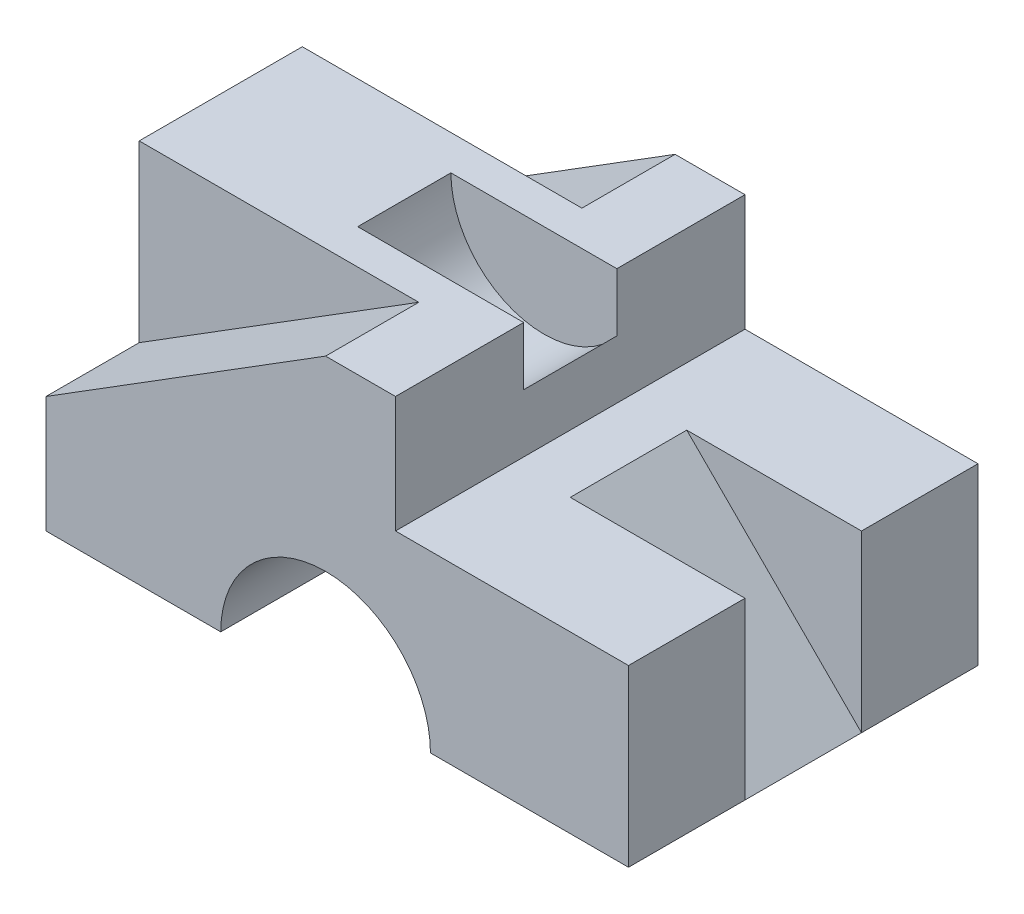
ISO-10303-21;
HEADER;
FILE_DESCRIPTION(('STEP AP214'),'2;1');
FILE_NAME('part.step','',(''),(''),'','','');
FILE_SCHEMA(('AUTOMOTIVE_DESIGN { 1 0 10303 214 1 1 1 1 }'));
ENDSEC;
DATA;
#1=APPLICATION_CONTEXT('core data for automotive mechanical design processes');
#2=APPLICATION_PROTOCOL_DEFINITION('international standard','automotive_design',2000,#1);
#3=PRODUCT_CONTEXT('',#1,'mechanical');
#4=PRODUCT('Part','Part','',(#3));
#5=PRODUCT_RELATED_PRODUCT_CATEGORY('part','',(#4));
#6=PRODUCT_DEFINITION_FORMATION('','',#4);
#7=PRODUCT_DEFINITION_CONTEXT('part definition',#1,'design');
#8=PRODUCT_DEFINITION('design','',#6,#7);
#9=PRODUCT_DEFINITION_SHAPE('','',#8);
#10=(LENGTH_UNIT() NAMED_UNIT(*) SI_UNIT(.MILLI.,.METRE.));
#11=(NAMED_UNIT(*) PLANE_ANGLE_UNIT() SI_UNIT($,.RADIAN.));
#12=(NAMED_UNIT(*) SI_UNIT($,.STERADIAN.) SOLID_ANGLE_UNIT());
#13=UNCERTAINTY_MEASURE_WITH_UNIT(LENGTH_MEASURE(1.E-05),#10,'distance_accuracy_value','');
#14=(GEOMETRIC_REPRESENTATION_CONTEXT(3) GLOBAL_UNCERTAINTY_ASSIGNED_CONTEXT((#13)) GLOBAL_UNIT_ASSIGNED_CONTEXT((#10,
#11,#12)) REPRESENTATION_CONTEXT('',''));
#15=CARTESIAN_POINT('',(0.,0.,0.));
#16=DIRECTION('',(0.,0.,1.));
#17=DIRECTION('',(1.,0.,0.));
#18=AXIS2_PLACEMENT_3D('',#15,#16,#17);
#19=CARTESIAN_POINT('',(60.,30.,-30.));
#20=DIRECTION('',(0.,1.,0.));
#21=DIRECTION('',(0.,0.,1.));
#22=AXIS2_PLACEMENT_3D('',#19,#20,#21);
#23=PLANE('',#22);
#24=DIRECTION('',(0.,0.,1.));
#25=VECTOR('',#24,1.);
#26=CARTESIAN_POINT('',(70.,30.,-10.));
#27=LINE('',#26,#25);
#28=CARTESIAN_POINT('',(70.,30.,-10.));
#29=VERTEX_POINT('',#28);
#30=CARTESIAN_POINT('',(70.,30.,10.));
#31=VERTEX_POINT('',#30);
#32=EDGE_CURVE('E169',#29,#31,#27,.T.);
#33=ORIENTED_EDGE('',*,*,#32,.F.);
#34=DIRECTION('',(-1.,0.,0.));
#35=VECTOR('',#34,1.);
#36=CARTESIAN_POINT('',(100.,30.,-10.));
#37=LINE('',#36,#35);
#38=CARTESIAN_POINT('',(100.,30.,-10.));
#39=VERTEX_POINT('',#38);
#40=EDGE_CURVE('E170',#39,#29,#37,.T.);
#41=ORIENTED_EDGE('',*,*,#40,.F.);
#42=DIRECTION('',(0.,0.,1.));
#43=VECTOR('',#42,1.);
#44=CARTESIAN_POINT('',(100.,30.,-30.));
#45=LINE('',#44,#43);
#46=CARTESIAN_POINT('',(100.,30.,-30.));
#47=VERTEX_POINT('',#46);
#48=EDGE_CURVE('E186',#47,#39,#45,.T.);
#49=ORIENTED_EDGE('',*,*,#48,.F.);
#50=DIRECTION('',(-1.,0.,0.));
#51=VECTOR('',#50,1.);
#52=CARTESIAN_POINT('',(60.,30.,-30.));
#53=LINE('',#52,#51);
#54=CARTESIAN_POINT('',(60.,30.,-30.));
#55=VERTEX_POINT('',#54);
#56=EDGE_CURVE('E331',#47,#55,#53,.T.);
#57=ORIENTED_EDGE('',*,*,#56,.T.);
#58=DIRECTION('',(0.,0.,1.));
#59=VECTOR('',#58,1.);
#60=CARTESIAN_POINT('',(60.,30.,-30.));
#61=LINE('',#60,#59);
#62=CARTESIAN_POINT('',(60.,30.,30.));
#63=VERTEX_POINT('',#62);
#64=EDGE_CURVE('E246',#55,#63,#61,.T.);
#65=ORIENTED_EDGE('',*,*,#64,.T.);
#66=DIRECTION('',(-1.,0.,0.));
#67=VECTOR('',#66,1.);
#68=CARTESIAN_POINT('',(60.,30.,30.));
#69=LINE('',#68,#67);
#70=CARTESIAN_POINT('',(100.,30.,30.));
#71=VERTEX_POINT('',#70);
#72=EDGE_CURVE('E230',#71,#63,#69,.T.);
#73=ORIENTED_EDGE('',*,*,#72,.F.);
#74=CARTESIAN_POINT('',(100.,30.,10.));
#75=VERTEX_POINT('',#74);
#76=EDGE_CURVE('E193',#75,#71,#45,.T.);
#77=ORIENTED_EDGE('',*,*,#76,.F.);
#78=DIRECTION('',(-1.,0.,0.));
#79=VECTOR('',#78,1.);
#80=CARTESIAN_POINT('',(100.,30.,10.));
#81=LINE('',#80,#79);
#82=EDGE_CURVE('E178',#75,#31,#81,.T.);
#83=ORIENTED_EDGE('',*,*,#82,.T.);
#84=EDGE_LOOP('',(#33,#41,#49,#57,#65,#73,#77,#83));
#85=FACE_BOUND('',#84,.T.);
#86=ADVANCED_FACE('F36',(#85),#23,.T.);
#87=CARTESIAN_POINT('',(100.,30.,-30.));
#88=DIRECTION('',(1.,0.,0.));
#89=DIRECTION('',(0.,0.,-1.));
#90=AXIS2_PLACEMENT_3D('',#87,#88,#89);
#91=PLANE('',#90);
#92=ORIENTED_EDGE('',*,*,#48,.T.);
#93=DIRECTION('',(0.,1.,0.));
#94=VECTOR('',#93,1.);
#95=CARTESIAN_POINT('',(100.,0.,-10.));
#96=LINE('',#95,#94);
#97=CARTESIAN_POINT('',(100.,0.,-10.));
#98=VERTEX_POINT('',#97);
#99=EDGE_CURVE('E175',#98,#39,#96,.T.);
#100=ORIENTED_EDGE('',*,*,#99,.F.);
#101=DIRECTION('',(0.,0.,1.));
#102=VECTOR('',#101,1.);
#103=CARTESIAN_POINT('',(100.,0.,-30.));
#104=LINE('',#103,#102);
#105=CARTESIAN_POINT('',(100.,0.,-30.));
#106=VERTEX_POINT('',#105);
#107=EDGE_CURVE('E184',#106,#98,#104,.T.);
#108=ORIENTED_EDGE('',*,*,#107,.F.);
#109=DIRECTION('',(0.,1.,0.));
#110=VECTOR('',#109,1.);
#111=CARTESIAN_POINT('',(100.,30.,-30.));
#112=LINE('',#111,#110);
#113=EDGE_CURVE('E329',#106,#47,#112,.T.);
#114=ORIENTED_EDGE('',*,*,#113,.T.);
#115=EDGE_LOOP('',(#92,#100,#108,#114));
#116=FACE_BOUND('',#115,.T.);
#117=ADVANCED_FACE('F182',(#116),#91,.T.);
#118=CARTESIAN_POINT('',(0.,50.,-30.));
#119=DIRECTION('',(0.,1.,0.));
#120=DIRECTION('',(0.,0.,1.));
#121=AXIS2_PLACEMENT_3D('',#118,#119,#120);
#122=PLANE('',#121);
#123=DIRECTION('',(0.,0.,1.));
#124=VECTOR('',#123,1.);
#125=CARTESIAN_POINT('',(31.5100040032032,50.,-8.));
#126=LINE('',#125,#124);
#127=CARTESIAN_POINT('',(31.5100040032032,50.,-8.));
#128=VERTEX_POINT('',#127);
#129=CARTESIAN_POINT('',(31.5100040032032,50.,8.));
#130=VERTEX_POINT('',#129);
#131=EDGE_CURVE('E288',#128,#130,#126,.T.);
#132=ORIENTED_EDGE('',*,*,#131,.F.);
#133=DIRECTION('',(-1.,0.,0.));
#134=VECTOR('',#133,1.);
#135=CARTESIAN_POINT('',(60.,50.,-8.));
#136=LINE('',#135,#134);
#137=CARTESIAN_POINT('',(60.,50.,-8.));
#138=VERTEX_POINT('',#137);
#139=EDGE_CURVE('E282',#138,#128,#136,.T.);
#140=ORIENTED_EDGE('',*,*,#139,.F.);
#141=DIRECTION('',(0.,0.,1.));
#142=VECTOR('',#141,1.);
#143=CARTESIAN_POINT('',(60.,50.,-30.));
#144=LINE('',#143,#142);
#145=CARTESIAN_POINT('',(60.,50.,-30.));
#146=VERTEX_POINT('',#145);
#147=EDGE_CURVE('E243',#146,#138,#144,.T.);
#148=ORIENTED_EDGE('',*,*,#147,.F.);
#149=DIRECTION('',(-1.,0.,0.));
#150=VECTOR('',#149,1.);
#151=CARTESIAN_POINT('',(48.,50.,-30.));
#152=LINE('',#151,#150);
#153=CARTESIAN_POINT('',(48.,50.,-30.));
#154=VERTEX_POINT('',#153);
#155=EDGE_CURVE('E206',#146,#154,#152,.T.);
#156=ORIENTED_EDGE('',*,*,#155,.T.);
#157=DIRECTION('',(0.,0.,-1.));
#158=VECTOR('',#157,1.);
#159=CARTESIAN_POINT('',(48.,50.,-14.));
#160=LINE('',#159,#158);
#161=CARTESIAN_POINT('',(48.,50.,-14.));
#162=VERTEX_POINT('',#161);
#163=EDGE_CURVE('E305',#162,#154,#160,.T.);
#164=ORIENTED_EDGE('',*,*,#163,.F.);
#165=DIRECTION('',(-1.,0.,0.));
#166=VECTOR('',#165,1.);
#167=CARTESIAN_POINT('',(48.,50.,-14.));
#168=LINE('',#167,#166);
#169=CARTESIAN_POINT('',(0.,50.,-14.));
#170=VERTEX_POINT('',#169);
#171=EDGE_CURVE('E300',#162,#170,#168,.T.);
#172=ORIENTED_EDGE('',*,*,#171,.T.);
#173=DIRECTION('',(0.,0.,1.));
#174=VECTOR('',#173,1.);
#175=CARTESIAN_POINT('',(0.,50.,-30.));
#176=LINE('',#175,#174);
#177=CARTESIAN_POINT('',(0.,50.,14.));
#178=VERTEX_POINT('',#177);
#179=EDGE_CURVE('E45',#170,#178,#176,.T.);
#180=ORIENTED_EDGE('',*,*,#179,.T.);
#181=DIRECTION('',(-1.,0.,0.));
#182=VECTOR('',#181,1.);
#183=CARTESIAN_POINT('',(48.,50.,14.));
#184=LINE('',#183,#182);
#185=CARTESIAN_POINT('',(48.,50.,14.));
#186=VERTEX_POINT('',#185);
#187=EDGE_CURVE('E318',#186,#178,#184,.T.);
#188=ORIENTED_EDGE('',*,*,#187,.F.);
#189=DIRECTION('',(0.,0.,1.));
#190=VECTOR('',#189,1.);
#191=CARTESIAN_POINT('',(48.,50.,14.));
#192=LINE('',#191,#190);
#193=CARTESIAN_POINT('',(48.,50.,30.));
#194=VERTEX_POINT('',#193);
#195=EDGE_CURVE('E221',#186,#194,#192,.T.);
#196=ORIENTED_EDGE('',*,*,#195,.T.);
#197=DIRECTION('',(-1.,0.,0.));
#198=VECTOR('',#197,1.);
#199=CARTESIAN_POINT('',(0.,50.,30.));
#200=LINE('',#199,#198);
#201=CARTESIAN_POINT('',(60.,50.,30.));
#202=VERTEX_POINT('',#201);
#203=EDGE_CURVE('E236',#202,#194,#200,.T.);
#204=ORIENTED_EDGE('',*,*,#203,.F.);
#205=CARTESIAN_POINT('',(60.,50.,8.));
#206=VERTEX_POINT('',#205);
#207=EDGE_CURVE('E245',#206,#202,#144,.T.);
#208=ORIENTED_EDGE('',*,*,#207,.F.);
#209=DIRECTION('',(-1.,0.,0.));
#210=VECTOR('',#209,1.);
#211=CARTESIAN_POINT('',(60.,50.,8.));
#212=LINE('',#211,#210);
#213=EDGE_CURVE('E61',#206,#130,#212,.T.);
#214=ORIENTED_EDGE('',*,*,#213,.T.);
#215=EDGE_LOOP('',(#132,#140,#148,#156,#164,#172,#180,#188,#196,#204,#208,#214));
#216=FACE_BOUND('',#215,.T.);
#217=ADVANCED_FACE('F260',(#216),#122,.T.);
#218=CARTESIAN_POINT('',(60.,50.,-30.));
#219=DIRECTION('',(1.,0.,0.));
#220=DIRECTION('',(0.,1.,0.));
#221=AXIS2_PLACEMENT_3D('',#218,#219,#220);
#222=PLANE('',#221);
#223=ORIENTED_EDGE('',*,*,#147,.T.);
#224=DIRECTION('',(0.,1.,0.));
#225=VECTOR('',#224,1.);
#226=CARTESIAN_POINT('',(60.,40.,-8.));
#227=LINE('',#226,#225);
#228=CARTESIAN_POINT('',(60.,40.,-8.));
#229=VERTEX_POINT('',#228);
#230=EDGE_CURVE('E280',#229,#138,#227,.T.);
#231=ORIENTED_EDGE('',*,*,#230,.F.);
#232=DIRECTION('',(0.,0.,1.));
#233=VECTOR('',#232,1.);
#234=CARTESIAN_POINT('',(60.,40.,-8.));
#235=LINE('',#234,#233);
#236=CARTESIAN_POINT('',(60.,40.,8.));
#237=VERTEX_POINT('',#236);
#238=EDGE_CURVE('E293',#229,#237,#235,.T.);
#239=ORIENTED_EDGE('',*,*,#238,.T.);
#240=DIRECTION('',(0.,1.,0.));
#241=VECTOR('',#240,1.);
#242=CARTESIAN_POINT('',(60.,40.,8.));
#243=LINE('',#242,#241);
#244=EDGE_CURVE('E256',#237,#206,#243,.T.);
#245=ORIENTED_EDGE('',*,*,#244,.T.);
#246=ORIENTED_EDGE('',*,*,#207,.T.);
#247=DIRECTION('',(0.,1.,0.));
#248=VECTOR('',#247,1.);
#249=CARTESIAN_POINT('',(60.,50.,30.));
#250=LINE('',#249,#248);
#251=EDGE_CURVE('E233',#63,#202,#250,.T.);
#252=ORIENTED_EDGE('',*,*,#251,.F.);
#253=ORIENTED_EDGE('',*,*,#64,.F.);
#254=DIRECTION('',(0.,1.,0.));
#255=VECTOR('',#254,1.);
#256=CARTESIAN_POINT('',(60.,50.,-30.));
#257=LINE('',#256,#255);
#258=EDGE_CURVE('E213',#55,#146,#257,.T.);
#259=ORIENTED_EDGE('',*,*,#258,.T.);
#260=EDGE_LOOP('',(#223,#231,#239,#245,#246,#252,#253,#259));
#261=FACE_BOUND('',#260,.T.);
#262=ADVANCED_FACE('F254',(#261),#222,.T.);
#263=CARTESIAN_POINT('',(0.,0.,-30.));
#264=DIRECTION('',(-1.,0.,0.));
#265=DIRECTION('',(0.,0.,1.));
#266=AXIS2_PLACEMENT_3D('',#263,#264,#265);
#267=PLANE('',#266);
#268=DIRECTION('',(0.,-1.,0.));
#269=VECTOR('',#268,1.);
#270=CARTESIAN_POINT('',(0.,50.,-14.));
#271=LINE('',#270,#269);
#272=CARTESIAN_POINT('',(0.,20.,-14.));
#273=VERTEX_POINT('',#272);
#274=EDGE_CURVE('E297',#170,#273,#271,.T.);
#275=ORIENTED_EDGE('',*,*,#274,.T.);
#276=DIRECTION('',(0.,0.,-1.));
#277=VECTOR('',#276,1.);
#278=CARTESIAN_POINT('',(0.,20.,-14.));
#279=LINE('',#278,#277);
#280=CARTESIAN_POINT('',(0.,20.,-30.));
#281=VERTEX_POINT('',#280);
#282=EDGE_CURVE('E308',#273,#281,#279,.T.);
#283=ORIENTED_EDGE('',*,*,#282,.T.);
#284=DIRECTION('',(0.,-1.,0.));
#285=VECTOR('',#284,1.);
#286=CARTESIAN_POINT('',(0.,20.,-30.));
#287=LINE('',#286,#285);
#288=CARTESIAN_POINT('',(0.,0.,-30.));
#289=VERTEX_POINT('',#288);
#290=EDGE_CURVE('E202',#281,#289,#287,.T.);
#291=ORIENTED_EDGE('',*,*,#290,.T.);
#292=DIRECTION('',(0.,0.,1.));
#293=VECTOR('',#292,1.);
#294=CARTESIAN_POINT('',(0.,0.,-30.));
#295=LINE('',#294,#293);
#296=CARTESIAN_POINT('',(0.,0.,30.));
#297=VERTEX_POINT('',#296);
#298=EDGE_CURVE('E11',#289,#297,#295,.T.);
#299=ORIENTED_EDGE('',*,*,#298,.T.);
#300=DIRECTION('',(0.,-1.,0.));
#301=VECTOR('',#300,1.);
#302=CARTESIAN_POINT('',(0.,0.,30.));
#303=LINE('',#302,#301);
#304=CARTESIAN_POINT('',(0.,20.,30.));
#305=VERTEX_POINT('',#304);
#306=EDGE_CURVE('E239',#305,#297,#303,.T.);
#307=ORIENTED_EDGE('',*,*,#306,.F.);
#308=DIRECTION('',(0.,0.,1.));
#309=VECTOR('',#308,1.);
#310=CARTESIAN_POINT('',(0.,20.,14.));
#311=LINE('',#310,#309);
#312=CARTESIAN_POINT('',(0.,20.,14.));
#313=VERTEX_POINT('',#312);
#314=EDGE_CURVE('E321',#313,#305,#311,.T.);
#315=ORIENTED_EDGE('',*,*,#314,.F.);
#316=DIRECTION('',(0.,-1.,0.));
#317=VECTOR('',#316,1.);
#318=CARTESIAN_POINT('',(0.,50.,14.));
#319=LINE('',#318,#317);
#320=EDGE_CURVE('E312',#178,#313,#319,.T.);
#321=ORIENTED_EDGE('',*,*,#320,.F.);
#322=ORIENTED_EDGE('',*,*,#179,.F.);
#323=EDGE_LOOP('',(#275,#283,#291,#299,#307,#315,#321,#322));
#324=FACE_BOUND('',#323,.T.);
#325=ADVANCED_FACE('F403',(#324),#267,.T.);
#326=CARTESIAN_POINT('',(48.,0.,-30.));
#327=DIRECTION('',(0.,0.,-1.));
#328=DIRECTION('',(-1.,0.,0.));
#329=AXIS2_PLACEMENT_3D('',#326,#327,#328);
#330=PLANE('',#329);
#331=ORIENTED_EDGE('',*,*,#290,.F.);
#332=DIRECTION('',(0.847998304005088,0.52999894000318,0.));
#333=VECTOR('',#332,1.);
#334=CARTESIAN_POINT('',(0.,20.,-30.));
#335=LINE('',#334,#333);
#336=EDGE_CURVE('E295',#281,#154,#335,.T.);
#337=ORIENTED_EDGE('',*,*,#336,.T.);
#338=ORIENTED_EDGE('',*,*,#155,.F.);
#339=ORIENTED_EDGE('',*,*,#258,.F.);
#340=ORIENTED_EDGE('',*,*,#56,.F.);
#341=ORIENTED_EDGE('',*,*,#113,.F.);
#342=DIRECTION('',(1.,0.,0.));
#343=VECTOR('',#342,1.);
#344=CARTESIAN_POINT('',(66.,0.,-30.));
#345=LINE('',#344,#343);
#346=CARTESIAN_POINT('',(66.,0.,-30.));
#347=VERTEX_POINT('',#346);
#348=EDGE_CURVE('E192',#347,#106,#345,.T.);
#349=ORIENTED_EDGE('',*,*,#348,.F.);
#350=CARTESIAN_POINT('',(48.,0.,-30.));
#351=DIRECTION('',(0.,0.,-1.));
#352=DIRECTION('',(-1.,0.,0.));
#353=AXIS2_PLACEMENT_3D('',#350,#351,#352);
#354=CIRCLE('',#353,18.);
#355=CARTESIAN_POINT('',(30.,0.,-30.));
#356=VERTEX_POINT('',#355);
#357=EDGE_CURVE('E326',#356,#347,#354,.T.);
#358=ORIENTED_EDGE('',*,*,#357,.F.);
#359=DIRECTION('',(1.,0.,0.));
#360=VECTOR('',#359,1.);
#361=CARTESIAN_POINT('',(0.,0.,-30.));
#362=LINE('',#361,#360);
#363=EDGE_CURVE('E240',#289,#356,#362,.T.);
#364=ORIENTED_EDGE('',*,*,#363,.F.);
#365=EDGE_LOOP('',(#331,#337,#338,#339,#340,#341,#349,#358,#364));
#366=FACE_BOUND('',#365,.T.);
#367=ADVANCED_FACE('F338',(#366),#330,.T.);
#368=CARTESIAN_POINT('',(0.,0.,-30.));
#369=DIRECTION('',(0.,-1.,0.));
#370=DIRECTION('',(0.,0.,-1.));
#371=AXIS2_PLACEMENT_3D('',#368,#369,#370);
#372=PLANE('',#371);
#373=DIRECTION('',(1.,0.,0.));
#374=VECTOR('',#373,1.);
#375=CARTESIAN_POINT('',(0.,0.,30.));
#376=LINE('',#375,#374);
#377=CARTESIAN_POINT('',(30.,0.,30.));
#378=VERTEX_POINT('',#377);
#379=EDGE_CURVE('E217',#297,#378,#376,.T.);
#380=ORIENTED_EDGE('',*,*,#379,.F.);
#381=ORIENTED_EDGE('',*,*,#298,.F.);
#382=ORIENTED_EDGE('',*,*,#363,.T.);
#383=DIRECTION('',(0.,0.,1.));
#384=VECTOR('',#383,1.);
#385=CARTESIAN_POINT('',(30.,0.,-30.));
#386=LINE('',#385,#384);
#387=EDGE_CURVE('E40',#356,#378,#386,.T.);
#388=ORIENTED_EDGE('',*,*,#387,.T.);
#389=EDGE_LOOP('',(#380,#381,#382,#388));
#390=FACE_BOUND('',#389,.T.);
#391=ADVANCED_FACE('F38',(#390),#372,.T.);
#392=DIRECTION('',(0.,1.,0.));
#393=VECTOR('',#392,1.);
#394=CARTESIAN_POINT('',(100.,0.,10.));
#395=LINE('',#394,#393);
#396=CARTESIAN_POINT('',(100.,0.,10.));
#397=VERTEX_POINT('',#396);
#398=EDGE_CURVE('E272',#397,#75,#395,.T.);
#399=ORIENTED_EDGE('',*,*,#398,.T.);
#400=ORIENTED_EDGE('',*,*,#76,.T.);
#401=DIRECTION('',(0.,1.,0.));
#402=VECTOR('',#401,1.);
#403=CARTESIAN_POINT('',(100.,30.,30.));
#404=LINE('',#403,#402);
#405=CARTESIAN_POINT('',(100.,0.,30.));
#406=VERTEX_POINT('',#405);
#407=EDGE_CURVE('E227',#406,#71,#404,.T.);
#408=ORIENTED_EDGE('',*,*,#407,.F.);
#409=EDGE_CURVE('E194',#397,#406,#104,.T.);
#410=ORIENTED_EDGE('',*,*,#409,.F.);
#411=EDGE_LOOP('',(#399,#400,#408,#410));
#412=FACE_BOUND('',#411,.T.);
#413=ADVANCED_FACE('F270',(#412),#91,.T.);
#414=CARTESIAN_POINT('',(66.,0.,-30.));
#415=DIRECTION('',(0.,-1.,0.));
#416=DIRECTION('',(0.,0.,-1.));
#417=AXIS2_PLACEMENT_3D('',#414,#415,#416);
#418=PLANE('',#417);
#419=DIRECTION('',(1.,0.,0.));
#420=VECTOR('',#419,1.);
#421=CARTESIAN_POINT('',(66.,0.,30.));
#422=LINE('',#421,#420);
#423=CARTESIAN_POINT('',(66.,0.,30.));
#424=VERTEX_POINT('',#423);
#425=EDGE_CURVE('E224',#424,#406,#422,.T.);
#426=ORIENTED_EDGE('',*,*,#425,.F.);
#427=DIRECTION('',(0.,0.,1.));
#428=VECTOR('',#427,1.);
#429=CARTESIAN_POINT('',(66.,0.,-30.));
#430=LINE('',#429,#428);
#431=EDGE_CURVE('E197',#347,#424,#430,.T.);
#432=ORIENTED_EDGE('',*,*,#431,.F.);
#433=ORIENTED_EDGE('',*,*,#348,.T.);
#434=ORIENTED_EDGE('',*,*,#107,.T.);
#435=DIRECTION('',(0.,0.,1.));
#436=VECTOR('',#435,1.);
#437=CARTESIAN_POINT('',(100.,0.,-10.));
#438=LINE('',#437,#436);
#439=EDGE_CURVE('E162',#98,#397,#438,.T.);
#440=ORIENTED_EDGE('',*,*,#439,.T.);
#441=ORIENTED_EDGE('',*,*,#409,.T.);
#442=EDGE_LOOP('',(#426,#432,#433,#434,#440,#441));
#443=FACE_BOUND('',#442,.T.);
#444=ADVANCED_FACE('F190',(#443),#418,.T.);
#445=CARTESIAN_POINT('',(48.,0.,-30.));
#446=DIRECTION('',(0.,0.,1.));
#447=DIRECTION('',(1.,0.,0.));
#448=AXIS2_PLACEMENT_3D('',#445,#446,#447);
#449=CYLINDRICAL_SURFACE('',#448,18.);
#450=CARTESIAN_POINT('',(48.,0.,30.));
#451=DIRECTION('',(0.,0.,-1.));
#452=DIRECTION('',(-1.,0.,0.));
#453=AXIS2_PLACEMENT_3D('',#450,#451,#452);
#454=CIRCLE('',#453,18.);
#455=EDGE_CURVE('E220',#378,#424,#454,.T.);
#456=ORIENTED_EDGE('',*,*,#455,.F.);
#457=ORIENTED_EDGE('',*,*,#387,.F.);
#458=ORIENTED_EDGE('',*,*,#357,.T.);
#459=ORIENTED_EDGE('',*,*,#431,.T.);
#460=EDGE_LOOP('',(#456,#457,#458,#459));
#461=FACE_BOUND('',#460,.T.);
#462=ADVANCED_FACE('F358',(#461),#449,.F.);
#463=CARTESIAN_POINT('',(48.,0.,30.));
#464=DIRECTION('',(0.,0.,-1.));
#465=DIRECTION('',(-1.,0.,0.));
#466=AXIS2_PLACEMENT_3D('',#463,#464,#465);
#467=PLANE('',#466);
#468=ORIENTED_EDGE('',*,*,#203,.T.);
#469=DIRECTION('',(0.847998304005088,0.52999894000318,0.));
#470=VECTOR('',#469,1.);
#471=CARTESIAN_POINT('',(0.,20.,30.));
#472=LINE('',#471,#470);
#473=EDGE_CURVE('E310',#305,#194,#472,.T.);
#474=ORIENTED_EDGE('',*,*,#473,.F.);
#475=ORIENTED_EDGE('',*,*,#306,.T.);
#476=ORIENTED_EDGE('',*,*,#379,.T.);
#477=ORIENTED_EDGE('',*,*,#455,.T.);
#478=ORIENTED_EDGE('',*,*,#425,.T.);
#479=ORIENTED_EDGE('',*,*,#407,.T.);
#480=ORIENTED_EDGE('',*,*,#72,.T.);
#481=ORIENTED_EDGE('',*,*,#251,.T.);
#482=EDGE_LOOP('',(#468,#474,#475,#476,#477,#478,#479,#480,#481));
#483=FACE_BOUND('',#482,.T.);
#484=ADVANCED_FACE('F264',(#483),#467,.F.);
#485=CARTESIAN_POINT('',(0.,20.,14.));
#486=DIRECTION('',(0.52999894000318,-0.847998304005088,0.));
#487=DIRECTION('',(0.847998304005088,0.52999894000318,0.));
#488=AXIS2_PLACEMENT_3D('',#485,#486,#487);
#489=PLANE('',#488);
#490=ORIENTED_EDGE('',*,*,#473,.T.);
#491=ORIENTED_EDGE('',*,*,#195,.F.);
#492=DIRECTION('',(0.847998304005088,0.52999894000318,0.));
#493=VECTOR('',#492,1.);
#494=CARTESIAN_POINT('',(0.,20.,14.));
#495=LINE('',#494,#493);
#496=EDGE_CURVE('E315',#313,#186,#495,.T.);
#497=ORIENTED_EDGE('',*,*,#496,.F.);
#498=ORIENTED_EDGE('',*,*,#314,.T.);
#499=EDGE_LOOP('',(#490,#491,#497,#498));
#500=FACE_BOUND('',#499,.T.);
#501=ADVANCED_FACE('F363',(#500),#489,.F.);
#502=CARTESIAN_POINT('',(0.,0.,14.));
#503=DIRECTION('',(0.,0.,-1.));
#504=DIRECTION('',(-1.,0.,0.));
#505=AXIS2_PLACEMENT_3D('',#502,#503,#504);
#506=PLANE('',#505);
#507=ORIENTED_EDGE('',*,*,#320,.T.);
#508=ORIENTED_EDGE('',*,*,#496,.T.);
#509=ORIENTED_EDGE('',*,*,#187,.T.);
#510=EDGE_LOOP('',(#507,#508,#509));
#511=FACE_BOUND('',#510,.T.);
#512=ADVANCED_FACE('F395',(#511),#506,.F.);
#513=CARTESIAN_POINT('',(0.,20.,-14.));
#514=DIRECTION('',(-0.52999894000318,0.847998304005088,0.));
#515=DIRECTION('',(-0.847998304005088,-0.52999894000318,0.));
#516=AXIS2_PLACEMENT_3D('',#513,#514,#515);
#517=PLANE('',#516);
#518=ORIENTED_EDGE('',*,*,#336,.F.);
#519=ORIENTED_EDGE('',*,*,#282,.F.);
#520=DIRECTION('',(0.847998304005088,0.52999894000318,0.));
#521=VECTOR('',#520,1.);
#522=CARTESIAN_POINT('',(0.,20.,-14.));
#523=LINE('',#522,#521);
#524=EDGE_CURVE('E303',#273,#162,#523,.T.);
#525=ORIENTED_EDGE('',*,*,#524,.T.);
#526=ORIENTED_EDGE('',*,*,#163,.T.);
#527=EDGE_LOOP('',(#518,#519,#525,#526));
#528=FACE_BOUND('',#527,.T.);
#529=ADVANCED_FACE('F391',(#528),#517,.T.);
#530=CARTESIAN_POINT('',(0.,0.,-14.));
#531=DIRECTION('',(0.,0.,1.));
#532=DIRECTION('',(-1.,0.,0.));
#533=AXIS2_PLACEMENT_3D('',#530,#531,#532);
#534=PLANE('',#533);
#535=ORIENTED_EDGE('',*,*,#274,.F.);
#536=ORIENTED_EDGE('',*,*,#171,.F.);
#537=ORIENTED_EDGE('',*,*,#524,.F.);
#538=EDGE_LOOP('',(#535,#536,#537));
#539=FACE_BOUND('',#538,.T.);
#540=ADVANCED_FACE('F388',(#539),#534,.F.);
#541=CARTESIAN_POINT('',(47.5100040032032,50.,-8.));
#542=DIRECTION('',(0.,0.,1.));
#543=DIRECTION('',(1.,0.,0.));
#544=AXIS2_PLACEMENT_3D('',#541,#542,#543);
#545=CYLINDRICAL_SURFACE('',#544,16.);
#546=CARTESIAN_POINT('',(47.5100040032032,50.,8.));
#547=DIRECTION('',(0.,0.,1.));
#548=DIRECTION('',(1.,0.,0.));
#549=AXIS2_PLACEMENT_3D('',#546,#547,#548);
#550=CIRCLE('',#549,16.);
#551=EDGE_CURVE('E283',#130,#237,#550,.T.);
#552=ORIENTED_EDGE('',*,*,#551,.T.);
#553=ORIENTED_EDGE('',*,*,#238,.F.);
#554=CARTESIAN_POINT('',(47.5100040032032,50.,-8.));
#555=DIRECTION('',(0.,0.,1.));
#556=DIRECTION('',(1.,0.,0.));
#557=AXIS2_PLACEMENT_3D('',#554,#555,#556);
#558=CIRCLE('',#557,16.);
#559=EDGE_CURVE('E285',#128,#229,#558,.T.);
#560=ORIENTED_EDGE('',*,*,#559,.F.);
#561=ORIENTED_EDGE('',*,*,#131,.T.);
#562=EDGE_LOOP('',(#552,#553,#560,#561));
#563=FACE_BOUND('',#562,.T.);
#564=ADVANCED_FACE('F376',(#563),#545,.F.);
#565=CARTESIAN_POINT('',(47.5100040032032,50.,-8.));
#566=DIRECTION('',(0.,0.,1.));
#567=DIRECTION('',(1.,0.,0.));
#568=AXIS2_PLACEMENT_3D('',#565,#566,#567);
#569=PLANE('',#568);
#570=ORIENTED_EDGE('',*,*,#230,.T.);
#571=ORIENTED_EDGE('',*,*,#139,.T.);
#572=ORIENTED_EDGE('',*,*,#559,.T.);
#573=EDGE_LOOP('',(#570,#571,#572));
#574=FACE_BOUND('',#573,.T.);
#575=ADVANCED_FACE('F374',(#574),#569,.T.);
#576=CARTESIAN_POINT('',(47.5100040032032,50.,8.));
#577=DIRECTION('',(0.,0.,1.));
#578=DIRECTION('',(1.,0.,0.));
#579=AXIS2_PLACEMENT_3D('',#576,#577,#578);
#580=PLANE('',#579);
#581=ORIENTED_EDGE('',*,*,#244,.F.);
#582=ORIENTED_EDGE('',*,*,#551,.F.);
#583=ORIENTED_EDGE('',*,*,#213,.F.);
#584=EDGE_LOOP('',(#581,#582,#583));
#585=FACE_BOUND('',#584,.T.);
#586=ADVANCED_FACE('F377',(#585),#580,.F.);
#587=CARTESIAN_POINT('',(70.,30.,-10.));
#588=DIRECTION('',(-0.707106781186548,-0.707106781186548,0.));
#589=DIRECTION('',(0.707106781186548,-0.707106781186548,0.));
#590=AXIS2_PLACEMENT_3D('',#587,#588,#589);
#591=PLANE('',#590);
#592=DIRECTION('',(0.707106781186547,-0.707106781186547,0.));
#593=VECTOR('',#592,1.);
#594=CARTESIAN_POINT('',(70.,30.,10.));
#595=LINE('',#594,#593);
#596=EDGE_CURVE('E53',#31,#397,#595,.T.);
#597=ORIENTED_EDGE('',*,*,#596,.T.);
#598=ORIENTED_EDGE('',*,*,#439,.F.);
#599=DIRECTION('',(0.707106781186547,-0.707106781186547,0.));
#600=VECTOR('',#599,1.);
#601=CARTESIAN_POINT('',(70.,30.,-10.));
#602=LINE('',#601,#600);
#603=EDGE_CURVE('E165',#29,#98,#602,.T.);
#604=ORIENTED_EDGE('',*,*,#603,.F.);
#605=ORIENTED_EDGE('',*,*,#32,.T.);
#606=EDGE_LOOP('',(#597,#598,#604,#605));
#607=FACE_BOUND('',#606,.T.);
#608=ADVANCED_FACE('F164',(#607),#591,.F.);
#609=CARTESIAN_POINT('',(0.,0.,-10.));
#610=DIRECTION('',(0.,0.,1.));
#611=DIRECTION('',(1.,0.,0.));
#612=AXIS2_PLACEMENT_3D('',#609,#610,#611);
#613=PLANE('',#612);
#614=ORIENTED_EDGE('',*,*,#603,.T.);
#615=ORIENTED_EDGE('',*,*,#99,.T.);
#616=ORIENTED_EDGE('',*,*,#40,.T.);
#617=EDGE_LOOP('',(#614,#615,#616));
#618=FACE_BOUND('',#617,.T.);
#619=ADVANCED_FACE('F174',(#618),#613,.T.);
#620=CARTESIAN_POINT('',(0.,0.,10.));
#621=DIRECTION('',(0.,0.,1.));
#622=DIRECTION('',(1.,0.,0.));
#623=AXIS2_PLACEMENT_3D('',#620,#621,#622);
#624=PLANE('',#623);
#625=ORIENTED_EDGE('',*,*,#596,.F.);
#626=ORIENTED_EDGE('',*,*,#82,.F.);
#627=ORIENTED_EDGE('',*,*,#398,.F.);
#628=EDGE_LOOP('',(#625,#626,#627));
#629=FACE_BOUND('',#628,.T.);
#630=ADVANCED_FACE('F339',(#629),#624,.F.);
#631=CLOSED_SHELL('',(#86,#117,#217,#262,#325,#367,#391,#413,#444,#462,#484,#501,#512,#529,#540,
#564,#575,#586,#608,#619,#630));
#632=MANIFOLD_SOLID_BREP('B2',#631);
#633=ADVANCED_BREP_SHAPE_REPRESENTATION('',(#18,#632),#14);
#634=SHAPE_DEFINITION_REPRESENTATION(#9,#633);
ENDSEC;
END-ISO-10303-21;
